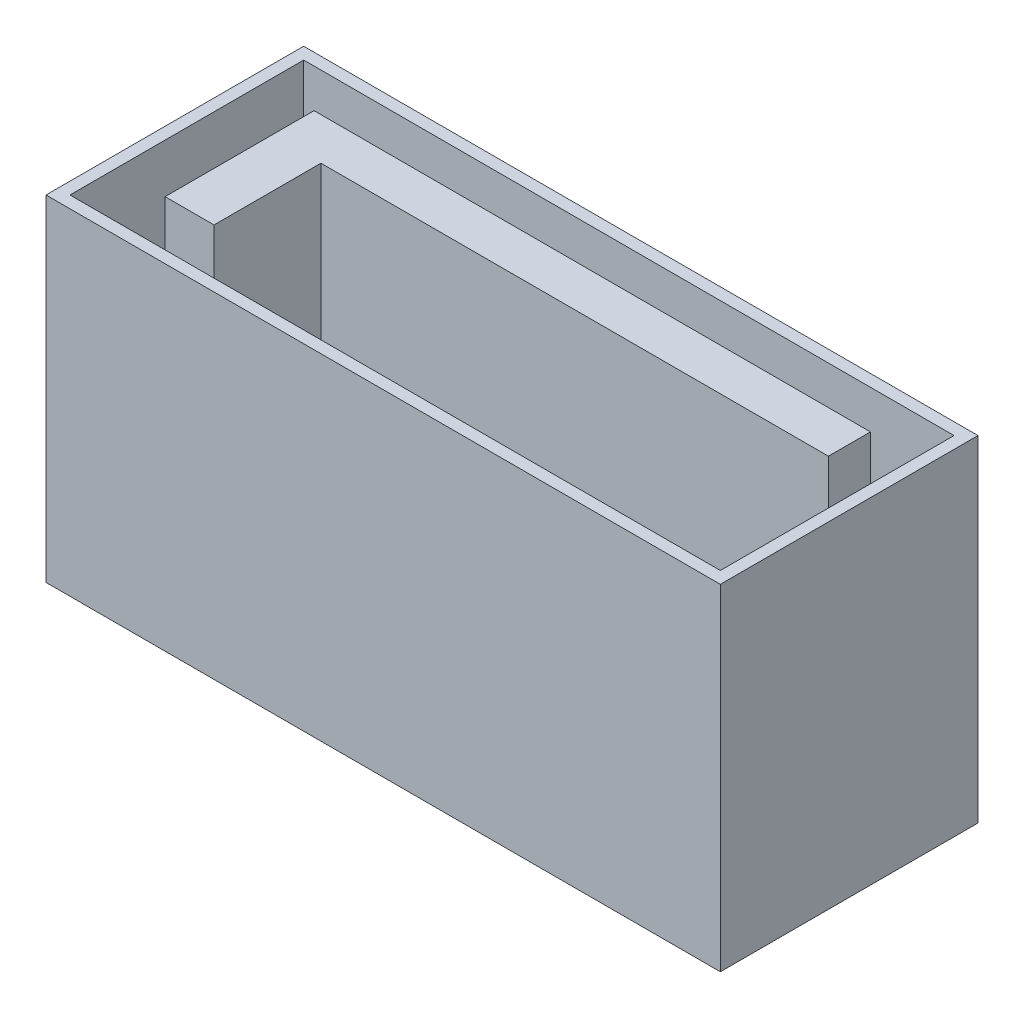
ISO-10303-21;
HEADER;
FILE_DESCRIPTION(('STEP AP214'),'2;1');
FILE_NAME('part.step','',(''),(''),'','','');
FILE_SCHEMA(('AUTOMOTIVE_DESIGN { 1 0 10303 214 1 1 1 1 }'));
ENDSEC;
DATA;
#1=APPLICATION_CONTEXT('core data for automotive mechanical design processes');
#2=APPLICATION_PROTOCOL_DEFINITION('international standard','automotive_design',2000,#1);
#3=PRODUCT_CONTEXT('',#1,'mechanical');
#4=PRODUCT('Part','Part','',(#3));
#5=PRODUCT_RELATED_PRODUCT_CATEGORY('part','',(#4));
#6=PRODUCT_DEFINITION_FORMATION('','',#4);
#7=PRODUCT_DEFINITION_CONTEXT('part definition',#1,'design');
#8=PRODUCT_DEFINITION('design','',#6,#7);
#9=PRODUCT_DEFINITION_SHAPE('','',#8);
#10=(LENGTH_UNIT() NAMED_UNIT(*) SI_UNIT(.MILLI.,.METRE.));
#11=(NAMED_UNIT(*) PLANE_ANGLE_UNIT() SI_UNIT($,.RADIAN.));
#12=(NAMED_UNIT(*) SI_UNIT($,.STERADIAN.) SOLID_ANGLE_UNIT());
#13=UNCERTAINTY_MEASURE_WITH_UNIT(LENGTH_MEASURE(1.E-05),#10,'distance_accuracy_value','');
#14=(GEOMETRIC_REPRESENTATION_CONTEXT(3) GLOBAL_UNCERTAINTY_ASSIGNED_CONTEXT((#13)) GLOBAL_UNIT_ASSIGNED_CONTEXT((#10,
#11,#12)) REPRESENTATION_CONTEXT('',''));
#15=CARTESIAN_POINT('',(0.,0.,0.));
#16=DIRECTION('',(0.,0.,1.));
#17=DIRECTION('',(1.,0.,0.));
#18=AXIS2_PLACEMENT_3D('',#15,#16,#17);
#19=CARTESIAN_POINT('',(7.015,0.3,-0.905));
#20=DIRECTION('',(1.,0.,0.));
#21=DIRECTION('',(0.,0.,-1.));
#22=AXIS2_PLACEMENT_3D('',#19,#20,#21);
#23=PLANE('',#22);
#24=DIRECTION('',(0.,1.,0.));
#25=VECTOR('',#24,1.);
#26=CARTESIAN_POINT('',(7.015,0.3,-0.905));
#27=LINE('',#26,#25);
#28=CARTESIAN_POINT('',(7.015,0.3,-0.905));
#29=VERTEX_POINT('',#28);
#30=CARTESIAN_POINT('',(7.015,8.4,-0.905));
#31=VERTEX_POINT('',#30);
#32=EDGE_CURVE('E152',#29,#31,#27,.T.);
#33=ORIENTED_EDGE('',*,*,#32,.F.);
#34=DIRECTION('',(0.,0.,-1.));
#35=VECTOR('',#34,1.);
#36=CARTESIAN_POINT('',(7.015,0.3,-0.905));
#37=LINE('',#36,#35);
#38=CARTESIAN_POINT('',(7.015,0.3,-1.958));
#39=VERTEX_POINT('',#38);
#40=EDGE_CURVE('E19',#29,#39,#37,.T.);
#41=ORIENTED_EDGE('',*,*,#40,.T.);
#42=DIRECTION('',(0.,1.,0.));
#43=VECTOR('',#42,1.);
#44=CARTESIAN_POINT('',(7.015,0.3,-1.958));
#45=LINE('',#44,#43);
#46=CARTESIAN_POINT('',(7.015,8.4,-1.958));
#47=VERTEX_POINT('',#46);
#48=EDGE_CURVE('E150',#47,#39,#45,.F.);
#49=ORIENTED_EDGE('',*,*,#48,.F.);
#50=DIRECTION('',(0.,0.,1.));
#51=VECTOR('',#50,1.);
#52=CARTESIAN_POINT('',(7.015,8.4,0.));
#53=LINE('',#52,#51);
#54=EDGE_CURVE('E131',#31,#47,#53,.F.);
#55=ORIENTED_EDGE('',*,*,#54,.F.);
#56=EDGE_LOOP('',(#33,#41,#49,#55));
#57=FACE_BOUND('',#56,.T.);
#58=ADVANCED_FACE('F16',(#57),#23,.T.);
#59=CARTESIAN_POINT('',(0.,8.4,0.));
#60=DIRECTION('',(0.,1.,0.));
#61=DIRECTION('',(0.,0.,1.));
#62=AXIS2_PLACEMENT_3D('',#59,#60,#61);
#63=PLANE('',#62);
#64=DIRECTION('',(0.,0.,1.));
#65=VECTOR('',#64,1.);
#66=CARTESIAN_POINT('',(-6.913,8.4,-1.958));
#67=LINE('',#66,#65);
#68=CARTESIAN_POINT('',(-6.913,8.4,1.771));
#69=VERTEX_POINT('',#68);
#70=CARTESIAN_POINT('',(-6.913,8.4,-1.958));
#71=VERTEX_POINT('',#70);
#72=EDGE_CURVE('E115',#69,#71,#67,.F.);
#73=ORIENTED_EDGE('',*,*,#72,.F.);
#74=DIRECTION('',(1.,0.,0.));
#75=VECTOR('',#74,1.);
#76=CARTESIAN_POINT('',(-6.913,8.4,1.771));
#77=LINE('',#76,#75);
#78=CARTESIAN_POINT('',(-5.688,8.4,1.771));
#79=VERTEX_POINT('',#78);
#80=EDGE_CURVE('E121',#79,#69,#77,.F.);
#81=ORIENTED_EDGE('',*,*,#80,.F.);
#82=DIRECTION('',(0.,0.,-1.));
#83=VECTOR('',#82,1.);
#84=CARTESIAN_POINT('',(-5.688,8.4,1.771));
#85=LINE('',#84,#83);
#86=CARTESIAN_POINT('',(-5.688,8.4,-0.905));
#87=VERTEX_POINT('',#86);
#88=EDGE_CURVE('E173',#87,#79,#85,.F.);
#89=ORIENTED_EDGE('',*,*,#88,.F.);
#90=DIRECTION('',(1.,0.,0.));
#91=VECTOR('',#90,1.);
#92=CARTESIAN_POINT('',(-5.688,8.4,-0.905));
#93=LINE('',#92,#91);
#94=EDGE_CURVE('E178',#31,#87,#93,.F.);
#95=ORIENTED_EDGE('',*,*,#94,.F.);
#96=ORIENTED_EDGE('',*,*,#54,.T.);
#97=DIRECTION('',(-1.,0.,0.));
#98=VECTOR('',#97,1.);
#99=CARTESIAN_POINT('',(7.015,8.4,-1.958));
#100=LINE('',#99,#98);
#101=EDGE_CURVE('E135',#71,#47,#100,.F.);
#102=ORIENTED_EDGE('',*,*,#101,.F.);
#103=EDGE_LOOP('',(#73,#81,#89,#95,#96,#102));
#104=FACE_BOUND('',#103,.T.);
#105=ADVANCED_FACE('F133',(#104),#63,.T.);
#106=CARTESIAN_POINT('',(-6.913,0.3,1.771));
#107=DIRECTION('',(0.,0.,1.));
#108=DIRECTION('',(1.,0.,0.));
#109=AXIS2_PLACEMENT_3D('',#106,#107,#108);
#110=PLANE('',#109);
#111=DIRECTION('',(0.,1.,0.));
#112=VECTOR('',#111,1.);
#113=CARTESIAN_POINT('',(-6.913,0.3,1.771));
#114=LINE('',#113,#112);
#115=CARTESIAN_POINT('',(-6.913,0.3,1.771));
#116=VERTEX_POINT('',#115);
#117=EDGE_CURVE('E123',#116,#69,#114,.T.);
#118=ORIENTED_EDGE('',*,*,#117,.F.);
#119=DIRECTION('',(1.,0.,0.));
#120=VECTOR('',#119,1.);
#121=CARTESIAN_POINT('',(-6.913,0.3,1.771));
#122=LINE('',#121,#120);
#123=CARTESIAN_POINT('',(-5.688,0.3,1.771));
#124=VERTEX_POINT('',#123);
#125=EDGE_CURVE('E130',#116,#124,#122,.T.);
#126=ORIENTED_EDGE('',*,*,#125,.T.);
#127=DIRECTION('',(0.,1.,0.));
#128=VECTOR('',#127,1.);
#129=CARTESIAN_POINT('',(-5.688,0.3,1.771));
#130=LINE('',#129,#128);
#131=EDGE_CURVE('E126',#79,#124,#130,.F.);
#132=ORIENTED_EDGE('',*,*,#131,.F.);
#133=ORIENTED_EDGE('',*,*,#80,.T.);
#134=EDGE_LOOP('',(#118,#126,#132,#133));
#135=FACE_BOUND('',#134,.T.);
#136=ADVANCED_FACE('F122',(#135),#110,.T.);
#137=CARTESIAN_POINT('',(-6.913,0.3,-1.958));
#138=DIRECTION('',(-1.,0.,0.));
#139=DIRECTION('',(0.,0.,1.));
#140=AXIS2_PLACEMENT_3D('',#137,#138,#139);
#141=PLANE('',#140);
#142=DIRECTION('',(0.,1.,0.));
#143=VECTOR('',#142,1.);
#144=CARTESIAN_POINT('',(-6.913,0.3,-1.958));
#145=LINE('',#144,#143);
#146=CARTESIAN_POINT('',(-6.913,0.3,-1.958));
#147=VERTEX_POINT('',#146);
#148=EDGE_CURVE('E137',#147,#71,#145,.T.);
#149=ORIENTED_EDGE('',*,*,#148,.F.);
#150=DIRECTION('',(0.,0.,1.));
#151=VECTOR('',#150,1.);
#152=CARTESIAN_POINT('',(-6.913,0.3,0.));
#153=LINE('',#152,#151);
#154=EDGE_CURVE('E141',#116,#147,#153,.F.);
#155=ORIENTED_EDGE('',*,*,#154,.F.);
#156=ORIENTED_EDGE('',*,*,#117,.T.);
#157=ORIENTED_EDGE('',*,*,#72,.T.);
#158=EDGE_LOOP('',(#149,#155,#156,#157));
#159=FACE_BOUND('',#158,.T.);
#160=ADVANCED_FACE('F139',(#159),#141,.T.);
#161=CARTESIAN_POINT('',(7.015,0.3,-1.958));
#162=DIRECTION('',(0.,0.,-1.));
#163=DIRECTION('',(-1.,0.,0.));
#164=AXIS2_PLACEMENT_3D('',#161,#162,#163);
#165=PLANE('',#164);
#166=ORIENTED_EDGE('',*,*,#48,.T.);
#167=DIRECTION('',(1.,0.,0.));
#168=VECTOR('',#167,1.);
#169=CARTESIAN_POINT('',(0.,0.3,-1.958));
#170=LINE('',#169,#168);
#171=EDGE_CURVE('E160',#147,#39,#170,.T.);
#172=ORIENTED_EDGE('',*,*,#171,.F.);
#173=ORIENTED_EDGE('',*,*,#148,.T.);
#174=ORIENTED_EDGE('',*,*,#101,.T.);
#175=EDGE_LOOP('',(#166,#172,#173,#174));
#176=FACE_BOUND('',#175,.T.);
#177=ADVANCED_FACE('F159',(#176),#165,.T.);
#178=CARTESIAN_POINT('',(-5.688,0.3,-0.905));
#179=DIRECTION('',(0.,0.,1.));
#180=DIRECTION('',(1.,0.,0.));
#181=AXIS2_PLACEMENT_3D('',#178,#179,#180);
#182=PLANE('',#181);
#183=DIRECTION('',(0.,1.,0.));
#184=VECTOR('',#183,1.);
#185=CARTESIAN_POINT('',(-5.688,0.3,-0.905));
#186=LINE('',#185,#184);
#187=CARTESIAN_POINT('',(-5.688,0.3,-0.905));
#188=VERTEX_POINT('',#187);
#189=EDGE_CURVE('E175',#188,#87,#186,.T.);
#190=ORIENTED_EDGE('',*,*,#189,.F.);
#191=DIRECTION('',(1.,0.,0.));
#192=VECTOR('',#191,1.);
#193=CARTESIAN_POINT('',(0.,0.3,-0.905));
#194=LINE('',#193,#192);
#195=EDGE_CURVE('E165',#29,#188,#194,.F.);
#196=ORIENTED_EDGE('',*,*,#195,.F.);
#197=ORIENTED_EDGE('',*,*,#32,.T.);
#198=ORIENTED_EDGE('',*,*,#94,.T.);
#199=EDGE_LOOP('',(#190,#196,#197,#198));
#200=FACE_BOUND('',#199,.T.);
#201=ADVANCED_FACE('F182',(#200),#182,.T.);
#202=CARTESIAN_POINT('',(-5.688,0.3,1.771));
#203=DIRECTION('',(1.,0.,0.));
#204=DIRECTION('',(0.,0.,-1.));
#205=AXIS2_PLACEMENT_3D('',#202,#203,#204);
#206=PLANE('',#205);
#207=ORIENTED_EDGE('',*,*,#131,.T.);
#208=DIRECTION('',(0.,0.,1.));
#209=VECTOR('',#208,1.);
#210=CARTESIAN_POINT('',(-5.688,0.3,0.));
#211=LINE('',#210,#209);
#212=EDGE_CURVE('E167',#188,#124,#211,.T.);
#213=ORIENTED_EDGE('',*,*,#212,.F.);
#214=ORIENTED_EDGE('',*,*,#189,.T.);
#215=ORIENTED_EDGE('',*,*,#88,.T.);
#216=EDGE_LOOP('',(#207,#213,#214,#215));
#217=FACE_BOUND('',#216,.T.);
#218=ADVANCED_FACE('F354',(#217),#206,.T.);
#219=CARTESIAN_POINT('',(0.,0.3,0.));
#220=DIRECTION('',(0.,1.,0.));
#221=DIRECTION('',(0.,0.,1.));
#222=AXIS2_PLACEMENT_3D('',#219,#220,#221);
#223=PLANE('',#222);
#224=ORIENTED_EDGE('',*,*,#212,.T.);
#225=ORIENTED_EDGE('',*,*,#125,.F.);
#226=ORIENTED_EDGE('',*,*,#154,.T.);
#227=ORIENTED_EDGE('',*,*,#171,.T.);
#228=ORIENTED_EDGE('',*,*,#40,.F.);
#229=ORIENTED_EDGE('',*,*,#195,.T.);
#230=EDGE_LOOP('',(#224,#225,#226,#227,#228,#229));
#231=FACE_BOUND('',#230,.T.);
#232=DIRECTION('',(-1.,0.,0.));
#233=VECTOR('',#232,1.);
#234=CARTESIAN_POINT('',(8.44,0.3,-2.925));
#235=LINE('',#234,#233);
#236=CARTESIAN_POINT('',(8.14,0.3,-2.925));
#237=VERTEX_POINT('',#236);
#238=CARTESIAN_POINT('',(-8.14,0.3,-2.925));
#239=VERTEX_POINT('',#238);
#240=EDGE_CURVE('E185',#237,#239,#235,.T.);
#241=ORIENTED_EDGE('',*,*,#240,.T.);
#242=DIRECTION('',(0.,0.,1.));
#243=VECTOR('',#242,1.);
#244=CARTESIAN_POINT('',(-8.14,0.3,-3.225));
#245=LINE('',#244,#243);
#246=CARTESIAN_POINT('',(-8.14,0.3,2.925));
#247=VERTEX_POINT('',#246);
#248=EDGE_CURVE('E199',#239,#247,#245,.T.);
#249=ORIENTED_EDGE('',*,*,#248,.T.);
#250=DIRECTION('',(1.,0.,0.));
#251=VECTOR('',#250,1.);
#252=CARTESIAN_POINT('',(-8.44,0.3,2.925));
#253=LINE('',#252,#251);
#254=CARTESIAN_POINT('',(8.14,0.3,2.925));
#255=VERTEX_POINT('',#254);
#256=EDGE_CURVE('E192',#247,#255,#253,.T.);
#257=ORIENTED_EDGE('',*,*,#256,.T.);
#258=DIRECTION('',(0.,0.,-1.));
#259=VECTOR('',#258,1.);
#260=CARTESIAN_POINT('',(8.14,0.3,3.225));
#261=LINE('',#260,#259);
#262=EDGE_CURVE('E186',#255,#237,#261,.T.);
#263=ORIENTED_EDGE('',*,*,#262,.T.);
#264=EDGE_LOOP('',(#241,#249,#257,#263));
#265=FACE_BOUND('',#264,.T.);
#266=ADVANCED_FACE('F163',(#231,#265),#223,.T.);
#267=CARTESIAN_POINT('',(8.44,0.,-2.925));
#268=DIRECTION('',(0.,0.,-1.));
#269=DIRECTION('',(-1.,0.,0.));
#270=AXIS2_PLACEMENT_3D('',#267,#268,#269);
#271=PLANE('',#270);
#272=ORIENTED_EDGE('',*,*,#240,.F.);
#273=DIRECTION('',(0.,1.,0.));
#274=VECTOR('',#273,1.);
#275=CARTESIAN_POINT('',(8.14,0.,-2.925));
#276=LINE('',#275,#274);
#277=CARTESIAN_POINT('',(8.14,8.4,-2.925));
#278=VERTEX_POINT('',#277);
#279=EDGE_CURVE('E190',#237,#278,#276,.T.);
#280=ORIENTED_EDGE('',*,*,#279,.T.);
#281=DIRECTION('',(1.,0.,0.));
#282=VECTOR('',#281,1.);
#283=CARTESIAN_POINT('',(0.,8.4,-2.925));
#284=LINE('',#283,#282);
#285=CARTESIAN_POINT('',(-8.14,8.4,-2.925));
#286=VERTEX_POINT('',#285);
#287=EDGE_CURVE('E211',#286,#278,#284,.T.);
#288=ORIENTED_EDGE('',*,*,#287,.F.);
#289=DIRECTION('',(0.,1.,0.));
#290=VECTOR('',#289,1.);
#291=CARTESIAN_POINT('',(-8.14,0.,-2.925));
#292=LINE('',#291,#290);
#293=EDGE_CURVE('E196',#286,#239,#292,.F.);
#294=ORIENTED_EDGE('',*,*,#293,.T.);
#295=EDGE_LOOP('',(#272,#280,#288,#294));
#296=FACE_BOUND('',#295,.T.);
#297=ADVANCED_FACE('F337',(#296),#271,.F.);
#298=CARTESIAN_POINT('',(8.14,0.,3.225));
#299=DIRECTION('',(1.,0.,0.));
#300=DIRECTION('',(0.,0.,-1.));
#301=AXIS2_PLACEMENT_3D('',#298,#299,#300);
#302=PLANE('',#301);
#303=ORIENTED_EDGE('',*,*,#262,.F.);
#304=DIRECTION('',(0.,1.,0.));
#305=VECTOR('',#304,1.);
#306=CARTESIAN_POINT('',(8.14,0.,2.925));
#307=LINE('',#306,#305);
#308=CARTESIAN_POINT('',(8.14,8.4,2.925));
#309=VERTEX_POINT('',#308);
#310=EDGE_CURVE('E194',#255,#309,#307,.T.);
#311=ORIENTED_EDGE('',*,*,#310,.T.);
#312=DIRECTION('',(0.,0.,1.));
#313=VECTOR('',#312,1.);
#314=CARTESIAN_POINT('',(8.14,8.4,0.));
#315=LINE('',#314,#313);
#316=EDGE_CURVE('E214',#278,#309,#315,.T.);
#317=ORIENTED_EDGE('',*,*,#316,.F.);
#318=ORIENTED_EDGE('',*,*,#279,.F.);
#319=EDGE_LOOP('',(#303,#311,#317,#318));
#320=FACE_BOUND('',#319,.T.);
#321=ADVANCED_FACE('F328',(#320),#302,.F.);
#322=CARTESIAN_POINT('',(-8.44,0.,2.925));
#323=DIRECTION('',(0.,0.,1.));
#324=DIRECTION('',(1.,0.,0.));
#325=AXIS2_PLACEMENT_3D('',#322,#323,#324);
#326=PLANE('',#325);
#327=ORIENTED_EDGE('',*,*,#256,.F.);
#328=DIRECTION('',(0.,1.,0.));
#329=VECTOR('',#328,1.);
#330=CARTESIAN_POINT('',(-8.14,0.,2.925));
#331=LINE('',#330,#329);
#332=CARTESIAN_POINT('',(-8.14,8.4,2.925));
#333=VERTEX_POINT('',#332);
#334=EDGE_CURVE('E201',#247,#333,#331,.T.);
#335=ORIENTED_EDGE('',*,*,#334,.T.);
#336=DIRECTION('',(1.,0.,0.));
#337=VECTOR('',#336,1.);
#338=CARTESIAN_POINT('',(0.,8.4,2.925));
#339=LINE('',#338,#337);
#340=EDGE_CURVE('E217',#309,#333,#339,.F.);
#341=ORIENTED_EDGE('',*,*,#340,.F.);
#342=ORIENTED_EDGE('',*,*,#310,.F.);
#343=EDGE_LOOP('',(#327,#335,#341,#342));
#344=FACE_BOUND('',#343,.T.);
#345=ADVANCED_FACE('F319',(#344),#326,.F.);
#346=CARTESIAN_POINT('',(-8.14,0.,-3.225));
#347=DIRECTION('',(-1.,0.,0.));
#348=DIRECTION('',(0.,0.,1.));
#349=AXIS2_PLACEMENT_3D('',#346,#347,#348);
#350=PLANE('',#349);
#351=ORIENTED_EDGE('',*,*,#248,.F.);
#352=ORIENTED_EDGE('',*,*,#293,.F.);
#353=DIRECTION('',(0.,0.,1.));
#354=VECTOR('',#353,1.);
#355=CARTESIAN_POINT('',(-8.14,8.4,0.));
#356=LINE('',#355,#354);
#357=EDGE_CURVE('E220',#333,#286,#356,.F.);
#358=ORIENTED_EDGE('',*,*,#357,.F.);
#359=ORIENTED_EDGE('',*,*,#334,.F.);
#360=EDGE_LOOP('',(#351,#352,#358,#359));
#361=FACE_BOUND('',#360,.T.);
#362=ADVANCED_FACE('F265',(#361),#350,.F.);
#363=CARTESIAN_POINT('',(-8.44,0.,3.225));
#364=DIRECTION('',(0.,0.,1.));
#365=DIRECTION('',(1.,0.,0.));
#366=AXIS2_PLACEMENT_3D('',#363,#364,#365);
#367=PLANE('',#366);
#368=DIRECTION('',(0.,1.,0.));
#369=VECTOR('',#368,1.);
#370=CARTESIAN_POINT('',(-8.44,0.,3.225));
#371=LINE('',#370,#369);
#372=CARTESIAN_POINT('',(-8.44,0.,3.225));
#373=VERTEX_POINT('',#372);
#374=CARTESIAN_POINT('',(-8.44,8.4,3.225));
#375=VERTEX_POINT('',#374);
#376=EDGE_CURVE('E203',#373,#375,#371,.T.);
#377=ORIENTED_EDGE('',*,*,#376,.F.);
#378=DIRECTION('',(1.,0.,0.));
#379=VECTOR('',#378,1.);
#380=CARTESIAN_POINT('',(0.,0.,3.225));
#381=LINE('',#380,#379);
#382=CARTESIAN_POINT('',(8.44,0.,3.225));
#383=VERTEX_POINT('',#382);
#384=EDGE_CURVE('E231',#373,#383,#381,.T.);
#385=ORIENTED_EDGE('',*,*,#384,.T.);
#386=DIRECTION('',(0.,1.,0.));
#387=VECTOR('',#386,1.);
#388=CARTESIAN_POINT('',(8.44,0.,3.225));
#389=LINE('',#388,#387);
#390=CARTESIAN_POINT('',(8.44,8.4,3.225));
#391=VERTEX_POINT('',#390);
#392=EDGE_CURVE('E226',#391,#383,#389,.F.);
#393=ORIENTED_EDGE('',*,*,#392,.F.);
#394=DIRECTION('',(1.,0.,0.));
#395=VECTOR('',#394,1.);
#396=CARTESIAN_POINT('',(0.,8.4,3.225));
#397=LINE('',#396,#395);
#398=EDGE_CURVE('E206',#375,#391,#397,.T.);
#399=ORIENTED_EDGE('',*,*,#398,.F.);
#400=EDGE_LOOP('',(#377,#385,#393,#399));
#401=FACE_BOUND('',#400,.T.);
#402=ADVANCED_FACE('F249',(#401),#367,.T.);
#403=CARTESIAN_POINT('',(-8.44,0.,-3.225));
#404=DIRECTION('',(-1.,0.,0.));
#405=DIRECTION('',(0.,0.,1.));
#406=AXIS2_PLACEMENT_3D('',#403,#404,#405);
#407=PLANE('',#406);
#408=DIRECTION('',(0.,1.,0.));
#409=VECTOR('',#408,1.);
#410=CARTESIAN_POINT('',(-8.44,0.,-3.225));
#411=LINE('',#410,#409);
#412=CARTESIAN_POINT('',(-8.44,0.,-3.225));
#413=VERTEX_POINT('',#412);
#414=CARTESIAN_POINT('',(-8.44,8.4,-3.225));
#415=VERTEX_POINT('',#414);
#416=EDGE_CURVE('E234',#413,#415,#411,.T.);
#417=ORIENTED_EDGE('',*,*,#416,.F.);
#418=DIRECTION('',(0.,0.,1.));
#419=VECTOR('',#418,1.);
#420=CARTESIAN_POINT('',(-8.44,0.,0.));
#421=LINE('',#420,#419);
#422=EDGE_CURVE('E228',#413,#373,#421,.T.);
#423=ORIENTED_EDGE('',*,*,#422,.T.);
#424=ORIENTED_EDGE('',*,*,#376,.T.);
#425=DIRECTION('',(0.,0.,1.));
#426=VECTOR('',#425,1.);
#427=CARTESIAN_POINT('',(-8.44,8.4,0.));
#428=LINE('',#427,#426);
#429=EDGE_CURVE('E208',#415,#375,#428,.T.);
#430=ORIENTED_EDGE('',*,*,#429,.F.);
#431=EDGE_LOOP('',(#417,#423,#424,#430));
#432=FACE_BOUND('',#431,.T.);
#433=ADVANCED_FACE('F255',(#432),#407,.T.);
#434=CARTESIAN_POINT('',(0.,8.4,0.));
#435=DIRECTION('',(0.,1.,0.));
#436=DIRECTION('',(0.,0.,1.));
#437=AXIS2_PLACEMENT_3D('',#434,#435,#436);
#438=PLANE('',#437);
#439=ORIENTED_EDGE('',*,*,#340,.T.);
#440=ORIENTED_EDGE('',*,*,#357,.T.);
#441=ORIENTED_EDGE('',*,*,#287,.T.);
#442=ORIENTED_EDGE('',*,*,#316,.T.);
#443=EDGE_LOOP('',(#439,#440,#441,#442));
#444=FACE_BOUND('',#443,.T.);
#445=DIRECTION('',(-1.,0.,0.));
#446=VECTOR('',#445,1.);
#447=CARTESIAN_POINT('',(8.44,8.4,-3.225));
#448=LINE('',#447,#446);
#449=CARTESIAN_POINT('',(8.44,8.4,-3.225));
#450=VERTEX_POINT('',#449);
#451=EDGE_CURVE('E237',#415,#450,#448,.F.);
#452=ORIENTED_EDGE('',*,*,#451,.F.);
#453=ORIENTED_EDGE('',*,*,#429,.T.);
#454=ORIENTED_EDGE('',*,*,#398,.T.);
#455=DIRECTION('',(0.,0.,-1.));
#456=VECTOR('',#455,1.);
#457=CARTESIAN_POINT('',(8.44,8.4,3.225));
#458=LINE('',#457,#456);
#459=EDGE_CURVE('E223',#450,#391,#458,.F.);
#460=ORIENTED_EDGE('',*,*,#459,.F.);
#461=EDGE_LOOP('',(#452,#453,#454,#460));
#462=FACE_BOUND('',#461,.T.);
#463=ADVANCED_FACE('F247',(#444,#462),#438,.T.);
#464=CARTESIAN_POINT('',(8.44,0.,3.225));
#465=DIRECTION('',(1.,0.,0.));
#466=DIRECTION('',(0.,0.,-1.));
#467=AXIS2_PLACEMENT_3D('',#464,#465,#466);
#468=PLANE('',#467);
#469=ORIENTED_EDGE('',*,*,#392,.T.);
#470=DIRECTION('',(0.,0.,1.));
#471=VECTOR('',#470,1.);
#472=CARTESIAN_POINT('',(8.44,0.,0.));
#473=LINE('',#472,#471);
#474=CARTESIAN_POINT('',(8.44,0.,-3.225));
#475=VERTEX_POINT('',#474);
#476=EDGE_CURVE('E34',#383,#475,#473,.F.);
#477=ORIENTED_EDGE('',*,*,#476,.T.);
#478=DIRECTION('',(0.,1.,0.));
#479=VECTOR('',#478,1.);
#480=CARTESIAN_POINT('',(8.44,0.,-3.225));
#481=LINE('',#480,#479);
#482=EDGE_CURVE('E25',#450,#475,#481,.F.);
#483=ORIENTED_EDGE('',*,*,#482,.F.);
#484=ORIENTED_EDGE('',*,*,#459,.T.);
#485=EDGE_LOOP('',(#469,#477,#483,#484));
#486=FACE_BOUND('',#485,.T.);
#487=ADVANCED_FACE('F244',(#486),#468,.T.);
#488=CARTESIAN_POINT('',(0.,0.,0.));
#489=DIRECTION('',(0.,1.,0.));
#490=DIRECTION('',(0.,0.,1.));
#491=AXIS2_PLACEMENT_3D('',#488,#489,#490);
#492=PLANE('',#491);
#493=ORIENTED_EDGE('',*,*,#476,.F.);
#494=ORIENTED_EDGE('',*,*,#384,.F.);
#495=ORIENTED_EDGE('',*,*,#422,.F.);
#496=DIRECTION('',(-1.,0.,0.));
#497=VECTOR('',#496,1.);
#498=CARTESIAN_POINT('',(8.44,0.,-3.225));
#499=LINE('',#498,#497);
#500=EDGE_CURVE('E11',#475,#413,#499,.T.);
#501=ORIENTED_EDGE('',*,*,#500,.F.);
#502=EDGE_LOOP('',(#493,#494,#495,#501));
#503=FACE_BOUND('',#502,.T.);
#504=ADVANCED_FACE('F253',(#503),#492,.F.);
#505=CARTESIAN_POINT('',(8.44,0.,-3.225));
#506=DIRECTION('',(0.,0.,-1.));
#507=DIRECTION('',(-1.,0.,0.));
#508=AXIS2_PLACEMENT_3D('',#505,#506,#507);
#509=PLANE('',#508);
#510=ORIENTED_EDGE('',*,*,#482,.T.);
#511=ORIENTED_EDGE('',*,*,#500,.T.);
#512=ORIENTED_EDGE('',*,*,#416,.T.);
#513=ORIENTED_EDGE('',*,*,#451,.T.);
#514=EDGE_LOOP('',(#510,#511,#512,#513));
#515=FACE_BOUND('',#514,.T.);
#516=ADVANCED_FACE('F242',(#515),#509,.T.);
#517=CLOSED_SHELL('',(#58,#105,#136,#160,#177,#201,#218,#266,#297,#321,#345,#362,#402,#433,#463,
#487,#504,#516));
#518=MANIFOLD_SOLID_BREP('B1',#517);
#519=ADVANCED_BREP_SHAPE_REPRESENTATION('',(#18,#518),#14);
#520=SHAPE_DEFINITION_REPRESENTATION(#9,#519);
ENDSEC;
END-ISO-10303-21;
